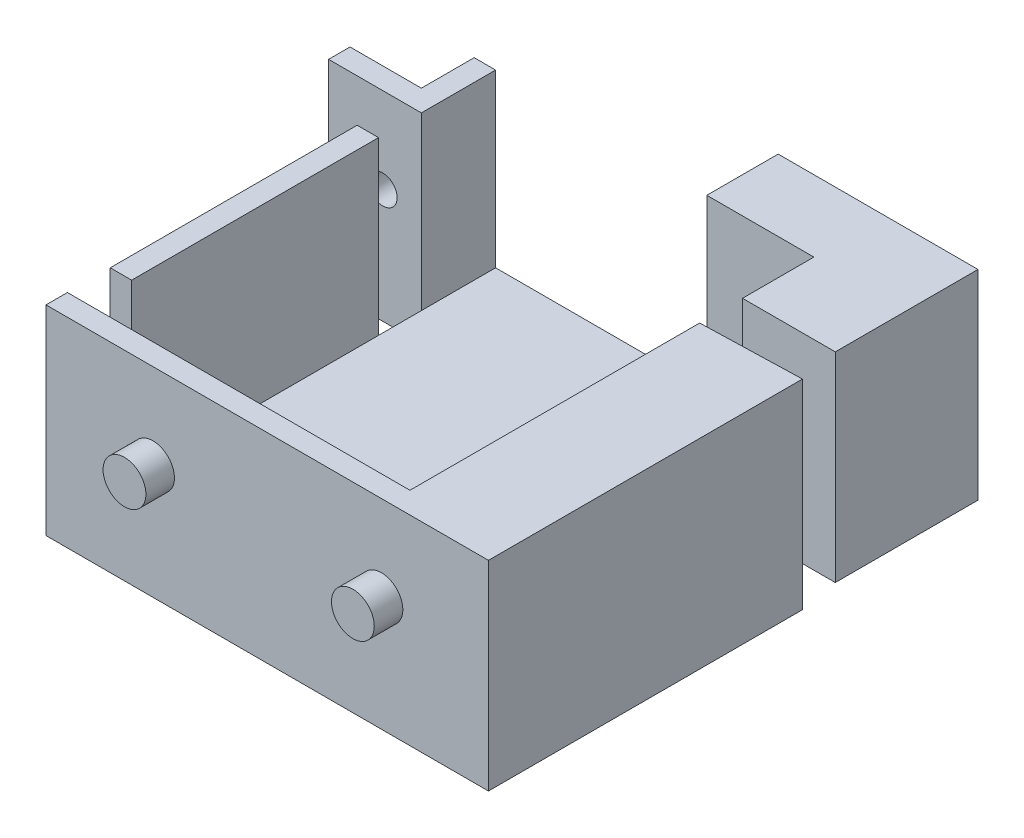
ISO-10303-21;
HEADER;
FILE_DESCRIPTION(('STEP AP214'),'2;1');
FILE_NAME('part.step','',(''),(''),'','','');
FILE_SCHEMA(('AUTOMOTIVE_DESIGN { 1 0 10303 214 1 1 1 1 }'));
ENDSEC;
DATA;
#1=APPLICATION_CONTEXT('core data for automotive mechanical design processes');
#2=APPLICATION_PROTOCOL_DEFINITION('international standard','automotive_design',2000,#1);
#3=PRODUCT_CONTEXT('',#1,'mechanical');
#4=PRODUCT('Part','Part','',(#3));
#5=PRODUCT_RELATED_PRODUCT_CATEGORY('part','',(#4));
#6=PRODUCT_DEFINITION_FORMATION('','',#4);
#7=PRODUCT_DEFINITION_CONTEXT('part definition',#1,'design');
#8=PRODUCT_DEFINITION('design','',#6,#7);
#9=PRODUCT_DEFINITION_SHAPE('','',#8);
#10=(LENGTH_UNIT() NAMED_UNIT(*) SI_UNIT(.MILLI.,.METRE.));
#11=(NAMED_UNIT(*) PLANE_ANGLE_UNIT() SI_UNIT($,.RADIAN.));
#12=(NAMED_UNIT(*) SI_UNIT($,.STERADIAN.) SOLID_ANGLE_UNIT());
#13=UNCERTAINTY_MEASURE_WITH_UNIT(LENGTH_MEASURE(1.E-05),#10,'distance_accuracy_value','');
#14=(GEOMETRIC_REPRESENTATION_CONTEXT(3) GLOBAL_UNCERTAINTY_ASSIGNED_CONTEXT((#13)) GLOBAL_UNIT_ASSIGNED_CONTEXT((#10,
#11,#12)) REPRESENTATION_CONTEXT('',''));
#15=CARTESIAN_POINT('',(0.,0.,0.));
#16=DIRECTION('',(0.,0.,1.));
#17=DIRECTION('',(1.,0.,0.));
#18=AXIS2_PLACEMENT_3D('',#15,#16,#17);
#19=CARTESIAN_POINT('',(-11.25,2.,15.));
#20=DIRECTION('',(1.,0.,0.));
#21=DIRECTION('',(0.,0.,-1.));
#22=AXIS2_PLACEMENT_3D('',#19,#20,#21);
#23=PLANE('',#22);
#24=DIRECTION('',(0.,0.,1.));
#25=VECTOR('',#24,1.);
#26=CARTESIAN_POINT('',(-11.25,0.,15.));
#27=LINE('',#26,#25);
#28=CARTESIAN_POINT('',(-11.25,0.,-9.8));
#29=VERTEX_POINT('',#28);
#30=CARTESIAN_POINT('',(-11.25,0.,-6.8));
#31=VERTEX_POINT('',#30);
#32=EDGE_CURVE('E223',#29,#31,#27,.T.);
#33=ORIENTED_EDGE('',*,*,#32,.T.);
#34=DIRECTION('',(0.,-1.,0.));
#35=VECTOR('',#34,1.);
#36=CARTESIAN_POINT('',(-11.25,37.0867927612304,-6.8));
#37=LINE('',#36,#35);
#38=CARTESIAN_POINT('',(-11.25,2.,-6.8));
#39=VERTEX_POINT('',#38);
#40=EDGE_CURVE('E57',#39,#31,#37,.T.);
#41=ORIENTED_EDGE('',*,*,#40,.F.);
#42=DIRECTION('',(0.,0.,1.));
#43=VECTOR('',#42,1.);
#44=CARTESIAN_POINT('',(-11.25,2.,15.));
#45=LINE('',#44,#43);
#46=CARTESIAN_POINT('',(-11.25,2.,-9.8));
#47=VERTEX_POINT('',#46);
#48=EDGE_CURVE('E401',#47,#39,#45,.T.);
#49=ORIENTED_EDGE('',*,*,#48,.F.);
#50=DIRECTION('',(0.,-1.,0.));
#51=VECTOR('',#50,1.);
#52=CARTESIAN_POINT('',(-11.25,37.0867927612304,-9.8));
#53=LINE('',#52,#51);
#54=EDGE_CURVE('E379',#47,#29,#53,.T.);
#55=ORIENTED_EDGE('',*,*,#54,.T.);
#56=EDGE_LOOP('',(#33,#41,#49,#55));
#57=FACE_BOUND('',#56,.T.);
#58=ADVANCED_FACE('F34',(#57),#23,.F.);
#59=CARTESIAN_POINT('',(0.,2.,0.));
#60=DIRECTION('',(0.,-1.,0.));
#61=DIRECTION('',(0.,0.,-1.));
#62=AXIS2_PLACEMENT_3D('',#59,#60,#61);
#63=PLANE('',#62);
#64=DIRECTION('',(-1.,0.,0.));
#65=VECTOR('',#64,1.);
#66=CARTESIAN_POINT('',(0.,2.,-14.8));
#67=LINE('',#66,#65);
#68=CARTESIAN_POINT('',(11.25,2.,-14.8));
#69=VERTEX_POINT('',#68);
#70=CARTESIAN_POINT('',(3.75,2.,-14.8));
#71=VERTEX_POINT('',#70);
#72=EDGE_CURVE('E322',#69,#71,#67,.T.);
#73=ORIENTED_EDGE('',*,*,#72,.T.);
#74=DIRECTION('',(0.,0.,-1.));
#75=VECTOR('',#74,1.);
#76=CARTESIAN_POINT('',(3.75,2.,0.));
#77=LINE('',#76,#75);
#78=CARTESIAN_POINT('',(3.75,2.,-15.));
#79=VERTEX_POINT('',#78);
#80=EDGE_CURVE('E326',#71,#79,#77,.T.);
#81=ORIENTED_EDGE('',*,*,#80,.T.);
#82=DIRECTION('',(-1.,0.,0.));
#83=VECTOR('',#82,1.);
#84=CARTESIAN_POINT('',(-11.25,2.,-15.));
#85=LINE('',#84,#83);
#86=CARTESIAN_POINT('',(-11.25,2.,-15.));
#87=VERTEX_POINT('',#86);
#88=EDGE_CURVE('E395',#79,#87,#85,.T.);
#89=ORIENTED_EDGE('',*,*,#88,.T.);
#90=EDGE_CURVE('E398',#87,#47,#45,.T.);
#91=ORIENTED_EDGE('',*,*,#90,.T.);
#92=ORIENTED_EDGE('',*,*,#48,.T.);
#93=DIRECTION('',(0.,0.,1.));
#94=VECTOR('',#93,1.);
#95=CARTESIAN_POINT('',(-11.25,2.,0.));
#96=LINE('',#95,#94);
#97=CARTESIAN_POINT('',(-11.25,2.,10.5));
#98=VERTEX_POINT('',#97);
#99=EDGE_CURVE('E256',#39,#98,#96,.T.);
#100=ORIENTED_EDGE('',*,*,#99,.T.);
#101=CARTESIAN_POINT('',(-11.25,2.,13.5));
#102=VERTEX_POINT('',#101);
#103=EDGE_CURVE('E49',#98,#102,#45,.T.);
#104=ORIENTED_EDGE('',*,*,#103,.T.);
#105=DIRECTION('',(-1.,0.,0.));
#106=VECTOR('',#105,1.);
#107=CARTESIAN_POINT('',(-11.25,2.,13.5));
#108=LINE('',#107,#106);
#109=CARTESIAN_POINT('',(11.25,2.,13.5));
#110=VERTEX_POINT('',#109);
#111=EDGE_CURVE('E381',#110,#102,#108,.T.);
#112=ORIENTED_EDGE('',*,*,#111,.F.);
#113=DIRECTION('',(0.,0.,-1.));
#114=VECTOR('',#113,1.);
#115=CARTESIAN_POINT('',(11.25,2.,15.));
#116=LINE('',#115,#114);
#117=CARTESIAN_POINT('',(11.25,2.,-6.79999999999999));
#118=VERTEX_POINT('',#117);
#119=EDGE_CURVE('E392',#110,#118,#116,.T.);
#120=ORIENTED_EDGE('',*,*,#119,.T.);
#121=CARTESIAN_POINT('',(11.25,2.,-9.8));
#122=VERTEX_POINT('',#121);
#123=EDGE_CURVE('E396',#118,#122,#116,.T.);
#124=ORIENTED_EDGE('',*,*,#123,.T.);
#125=DIRECTION('',(0.,0.,-1.));
#126=VECTOR('',#125,1.);
#127=CARTESIAN_POINT('',(11.25,2.,0.));
#128=LINE('',#127,#126);
#129=EDGE_CURVE('E320',#122,#69,#128,.T.);
#130=ORIENTED_EDGE('',*,*,#129,.T.);
#131=EDGE_LOOP('',(#73,#81,#89,#91,#92,#100,#104,#112,#120,#124,#130));
#132=FACE_BOUND('',#131,.T.);
#133=ADVANCED_FACE('F423',(#132),#63,.F.);
#134=CARTESIAN_POINT('',(11.25,2.,15.));
#135=DIRECTION('',(-1.,0.,0.));
#136=DIRECTION('',(0.,0.,1.));
#137=AXIS2_PLACEMENT_3D('',#134,#135,#136);
#138=PLANE('',#137);
#139=ORIENTED_EDGE('',*,*,#123,.F.);
#140=DIRECTION('',(0.,-1.,0.));
#141=VECTOR('',#140,1.);
#142=CARTESIAN_POINT('',(11.25,37.0867927612304,-6.79999999999999));
#143=LINE('',#142,#141);
#144=CARTESIAN_POINT('',(11.25,0.,-6.79999999999999));
#145=VERTEX_POINT('',#144);
#146=EDGE_CURVE('E278',#118,#145,#143,.T.);
#147=ORIENTED_EDGE('',*,*,#146,.T.);
#148=DIRECTION('',(0.,0.,-1.));
#149=VECTOR('',#148,1.);
#150=CARTESIAN_POINT('',(11.25,0.,15.));
#151=LINE('',#150,#149);
#152=CARTESIAN_POINT('',(11.25,0.,-9.8));
#153=VERTEX_POINT('',#152);
#154=EDGE_CURVE('E391',#145,#153,#151,.T.);
#155=ORIENTED_EDGE('',*,*,#154,.T.);
#156=DIRECTION('',(0.,-1.,0.));
#157=VECTOR('',#156,1.);
#158=CARTESIAN_POINT('',(11.25,37.0867927612304,-9.79999999999999));
#159=LINE('',#158,#157);
#160=EDGE_CURVE('E303',#122,#153,#159,.T.);
#161=ORIENTED_EDGE('',*,*,#160,.F.);
#162=EDGE_LOOP('',(#139,#147,#155,#161));
#163=FACE_BOUND('',#162,.T.);
#164=ADVANCED_FACE('F36',(#163),#138,.F.);
#165=CARTESIAN_POINT('',(-11.25,2.,-15.));
#166=DIRECTION('',(0.,0.,1.));
#167=DIRECTION('',(1.,0.,0.));
#168=AXIS2_PLACEMENT_3D('',#165,#166,#167);
#169=PLANE('',#168);
#170=ORIENTED_EDGE('',*,*,#88,.F.);
#171=DIRECTION('',(0.,-1.,0.));
#172=VECTOR('',#171,1.);
#173=CARTESIAN_POINT('',(3.75,2.,-15.));
#174=LINE('',#173,#172);
#175=CARTESIAN_POINT('',(3.75,0.,-15.));
#176=VERTEX_POINT('',#175);
#177=EDGE_CURVE('E324',#79,#176,#174,.T.);
#178=ORIENTED_EDGE('',*,*,#177,.T.);
#179=DIRECTION('',(-1.,0.,0.));
#180=VECTOR('',#179,1.);
#181=CARTESIAN_POINT('',(-11.25,0.,-15.));
#182=LINE('',#181,#180);
#183=CARTESIAN_POINT('',(-12.75,0.,-15.));
#184=VERTEX_POINT('',#183);
#185=EDGE_CURVE('E224',#176,#184,#182,.T.);
#186=ORIENTED_EDGE('',*,*,#185,.T.);
#187=DIRECTION('',(0.,-1.,0.));
#188=VECTOR('',#187,1.);
#189=CARTESIAN_POINT('',(-12.75,37.0867927612304,-15.));
#190=LINE('',#189,#188);
#191=CARTESIAN_POINT('',(-12.75,14.,-15.));
#192=VERTEX_POINT('',#191);
#193=EDGE_CURVE('E368',#192,#184,#190,.T.);
#194=ORIENTED_EDGE('',*,*,#193,.F.);
#195=DIRECTION('',(-1.,0.,0.));
#196=VECTOR('',#195,1.);
#197=CARTESIAN_POINT('',(-11.25,14.,-15.));
#198=LINE('',#197,#196);
#199=CARTESIAN_POINT('',(-11.25,14.,-15.));
#200=VERTEX_POINT('',#199);
#201=EDGE_CURVE('E349',#200,#192,#198,.T.);
#202=ORIENTED_EDGE('',*,*,#201,.F.);
#203=DIRECTION('',(0.,-1.,0.));
#204=VECTOR('',#203,1.);
#205=CARTESIAN_POINT('',(-11.25,37.0867927612304,-15.));
#206=LINE('',#205,#204);
#207=EDGE_CURVE('E345',#200,#87,#206,.T.);
#208=ORIENTED_EDGE('',*,*,#207,.T.);
#209=EDGE_LOOP('',(#170,#178,#186,#194,#202,#208));
#210=FACE_BOUND('',#209,.T.);
#211=ADVANCED_FACE('F433',(#210),#169,.F.);
#212=ORIENTED_EDGE('',*,*,#103,.F.);
#213=DIRECTION('',(0.,-1.,0.));
#214=VECTOR('',#213,1.);
#215=CARTESIAN_POINT('',(-11.25,37.0867927612304,10.5));
#216=LINE('',#215,#214);
#217=CARTESIAN_POINT('',(-11.25,0.,10.5));
#218=VERTEX_POINT('',#217);
#219=EDGE_CURVE('E227',#98,#218,#216,.T.);
#220=ORIENTED_EDGE('',*,*,#219,.T.);
#221=CARTESIAN_POINT('',(-11.25,0.,13.5));
#222=VERTEX_POINT('',#221);
#223=EDGE_CURVE('E212',#218,#222,#27,.T.);
#224=ORIENTED_EDGE('',*,*,#223,.T.);
#225=DIRECTION('',(0.,-1.,0.));
#226=VECTOR('',#225,1.);
#227=CARTESIAN_POINT('',(-11.25,37.0867927612304,13.5));
#228=LINE('',#227,#226);
#229=EDGE_CURVE('E339',#102,#222,#228,.T.);
#230=ORIENTED_EDGE('',*,*,#229,.F.);
#231=EDGE_LOOP('',(#212,#220,#224,#230));
#232=FACE_BOUND('',#231,.T.);
#233=ADVANCED_FACE('F228',(#232),#23,.F.);
#234=CARTESIAN_POINT('',(-11.25,2.,15.));
#235=DIRECTION('',(0.,0.,-1.));
#236=DIRECTION('',(-1.,0.,0.));
#237=AXIS2_PLACEMENT_3D('',#234,#235,#236);
#238=PLANE('',#237);
#239=CARTESIAN_POINT('',(-5.24999999999996,8.,15.));
#240=DIRECTION('',(0.,0.,-1.));
#241=DIRECTION('',(-1.,0.,0.));
#242=AXIS2_PLACEMENT_3D('',#239,#240,#241);
#243=CIRCLE('',#242,1.5);
#244=CARTESIAN_POINT('',(-6.74999999999996,8.,15.));
#245=VERTEX_POINT('',#244);
#246=EDGE_CURVE('E11',#245,#245,#243,.F.);
#247=ORIENTED_EDGE('',*,*,#246,.F.);
#248=EDGE_LOOP('',(#247));
#249=FACE_BOUND('',#248,.T.);
#250=CARTESIAN_POINT('',(10.75,8.,15.));
#251=DIRECTION('',(0.,0.,-1.));
#252=DIRECTION('',(-1.,0.,0.));
#253=AXIS2_PLACEMENT_3D('',#250,#251,#252);
#254=CIRCLE('',#253,1.5);
#255=CARTESIAN_POINT('',(9.25,8.,15.));
#256=VERTEX_POINT('',#255);
#257=EDGE_CURVE('E42',#256,#256,#254,.F.);
#258=ORIENTED_EDGE('',*,*,#257,.F.);
#259=EDGE_LOOP('',(#258));
#260=FACE_BOUND('',#259,.T.);
#261=DIRECTION('',(1.,0.,0.));
#262=VECTOR('',#261,1.);
#263=CARTESIAN_POINT('',(-11.25,0.,15.));
#264=LINE('',#263,#262);
#265=CARTESIAN_POINT('',(-12.75,0.,15.));
#266=VERTEX_POINT('',#265);
#267=CARTESIAN_POINT('',(18.25,0.,15.));
#268=VERTEX_POINT('',#267);
#269=EDGE_CURVE('E404',#266,#268,#264,.T.);
#270=ORIENTED_EDGE('',*,*,#269,.T.);
#271=DIRECTION('',(0.,-1.,0.));
#272=VECTOR('',#271,1.);
#273=CARTESIAN_POINT('',(18.25,37.0867927612304,15.));
#274=LINE('',#273,#272);
#275=CARTESIAN_POINT('',(18.25,14.,15.));
#276=VERTEX_POINT('',#275);
#277=EDGE_CURVE('E273',#276,#268,#274,.T.);
#278=ORIENTED_EDGE('',*,*,#277,.F.);
#279=DIRECTION('',(1.,0.,0.));
#280=VECTOR('',#279,1.);
#281=CARTESIAN_POINT('',(-11.25,14.,15.));
#282=LINE('',#281,#280);
#283=CARTESIAN_POINT('',(-12.75,14.,15.));
#284=VERTEX_POINT('',#283);
#285=EDGE_CURVE('E382',#284,#276,#282,.T.);
#286=ORIENTED_EDGE('',*,*,#285,.F.);
#287=DIRECTION('',(0.,-1.,0.));
#288=VECTOR('',#287,1.);
#289=CARTESIAN_POINT('',(-12.75,37.0867927612304,15.));
#290=LINE('',#289,#288);
#291=EDGE_CURVE('E333',#284,#266,#290,.T.);
#292=ORIENTED_EDGE('',*,*,#291,.T.);
#293=EDGE_LOOP('',(#270,#278,#286,#292));
#294=FACE_BOUND('',#293,.T.);
#295=ADVANCED_FACE('F475',(#249,#260,#294),#238,.F.);
#296=CARTESIAN_POINT('',(0.,0.,0.));
#297=DIRECTION('',(0.,-1.,0.));
#298=DIRECTION('',(0.,0.,-1.));
#299=AXIS2_PLACEMENT_3D('',#296,#297,#298);
#300=PLANE('',#299);
#301=ORIENTED_EDGE('',*,*,#185,.F.);
#302=DIRECTION('',(0.,0.,-1.));
#303=VECTOR('',#302,1.);
#304=CARTESIAN_POINT('',(3.75,0.,-14.8));
#305=LINE('',#304,#303);
#306=CARTESIAN_POINT('',(3.75,0.,-19.8));
#307=VERTEX_POINT('',#306);
#308=EDGE_CURVE('E267',#176,#307,#305,.T.);
#309=ORIENTED_EDGE('',*,*,#308,.T.);
#310=DIRECTION('',(1.,0.,0.));
#311=VECTOR('',#310,1.);
#312=CARTESIAN_POINT('',(3.75,0.,-19.8));
#313=LINE('',#312,#311);
#314=CARTESIAN_POINT('',(17.75,0.,-19.8));
#315=VERTEX_POINT('',#314);
#316=EDGE_CURVE('E294',#307,#315,#313,.T.);
#317=ORIENTED_EDGE('',*,*,#316,.T.);
#318=DIRECTION('',(0.,0.,1.));
#319=VECTOR('',#318,1.);
#320=CARTESIAN_POINT('',(17.75,0.,-11.3));
#321=LINE('',#320,#319);
#322=CARTESIAN_POINT('',(17.75,0.,-9.79999999999999));
#323=VERTEX_POINT('',#322);
#324=EDGE_CURVE('E297',#315,#323,#321,.T.);
#325=ORIENTED_EDGE('',*,*,#324,.T.);
#326=DIRECTION('',(-1.,0.,0.));
#327=VECTOR('',#326,1.);
#328=CARTESIAN_POINT('',(17.75,0.,-9.79999999999999));
#329=LINE('',#328,#327);
#330=EDGE_CURVE('E300',#323,#153,#329,.T.);
#331=ORIENTED_EDGE('',*,*,#330,.T.);
#332=ORIENTED_EDGE('',*,*,#154,.F.);
#333=DIRECTION('',(0.999592086460695,0.,-0.0285597738988772));
#334=VECTOR('',#333,1.);
#335=CARTESIAN_POINT('',(18.25,0.,-7.));
#336=LINE('',#335,#334);
#337=CARTESIAN_POINT('',(18.25,0.,-7.));
#338=VERTEX_POINT('',#337);
#339=EDGE_CURVE('E270',#145,#338,#336,.T.);
#340=ORIENTED_EDGE('',*,*,#339,.T.);
#341=DIRECTION('',(0.,0.,1.));
#342=VECTOR('',#341,1.);
#343=CARTESIAN_POINT('',(18.25,0.,-7.));
#344=LINE('',#343,#342);
#345=EDGE_CURVE('E259',#338,#268,#344,.T.);
#346=ORIENTED_EDGE('',*,*,#345,.T.);
#347=ORIENTED_EDGE('',*,*,#269,.F.);
#348=DIRECTION('',(0.,0.,-1.));
#349=VECTOR('',#348,1.);
#350=CARTESIAN_POINT('',(-12.75,0.,13.5));
#351=LINE('',#350,#349);
#352=CARTESIAN_POINT('',(-12.75,0.,13.5));
#353=VERTEX_POINT('',#352);
#354=EDGE_CURVE('E328',#266,#353,#351,.T.);
#355=ORIENTED_EDGE('',*,*,#354,.T.);
#356=DIRECTION('',(1.,0.,0.));
#357=VECTOR('',#356,1.);
#358=CARTESIAN_POINT('',(-11.25,0.,13.5));
#359=LINE('',#358,#357);
#360=EDGE_CURVE('E221',#353,#222,#359,.T.);
#361=ORIENTED_EDGE('',*,*,#360,.T.);
#362=ORIENTED_EDGE('',*,*,#223,.F.);
#363=DIRECTION('',(-1.,0.,0.));
#364=VECTOR('',#363,1.);
#365=CARTESIAN_POINT('',(-11.25,0.,10.5));
#366=LINE('',#365,#364);
#367=CARTESIAN_POINT('',(-12.75,0.,10.5));
#368=VERTEX_POINT('',#367);
#369=EDGE_CURVE('E217',#218,#368,#366,.T.);
#370=ORIENTED_EDGE('',*,*,#369,.T.);
#371=DIRECTION('',(0.,0.,-1.));
#372=VECTOR('',#371,1.);
#373=CARTESIAN_POINT('',(-12.75,0.,-6.8));
#374=LINE('',#373,#372);
#375=CARTESIAN_POINT('',(-12.75,0.,-6.8));
#376=VERTEX_POINT('',#375);
#377=EDGE_CURVE('E239',#368,#376,#374,.T.);
#378=ORIENTED_EDGE('',*,*,#377,.T.);
#379=DIRECTION('',(1.,0.,0.));
#380=VECTOR('',#379,1.);
#381=CARTESIAN_POINT('',(-12.75,0.,-6.8));
#382=LINE('',#381,#380);
#383=EDGE_CURVE('E240',#376,#31,#382,.T.);
#384=ORIENTED_EDGE('',*,*,#383,.T.);
#385=ORIENTED_EDGE('',*,*,#32,.F.);
#386=DIRECTION('',(-1.,0.,0.));
#387=VECTOR('',#386,1.);
#388=CARTESIAN_POINT('',(-17.75,0.,-9.8));
#389=LINE('',#388,#387);
#390=CARTESIAN_POINT('',(-17.75,0.,-9.8));
#391=VERTEX_POINT('',#390);
#392=EDGE_CURVE('E332',#29,#391,#389,.T.);
#393=ORIENTED_EDGE('',*,*,#392,.T.);
#394=DIRECTION('',(0.,0.,-1.));
#395=VECTOR('',#394,1.);
#396=CARTESIAN_POINT('',(-17.75,0.,-11.3));
#397=LINE('',#396,#395);
#398=CARTESIAN_POINT('',(-17.75,0.,-11.3));
#399=VERTEX_POINT('',#398);
#400=EDGE_CURVE('E356',#391,#399,#397,.T.);
#401=ORIENTED_EDGE('',*,*,#400,.T.);
#402=DIRECTION('',(1.,0.,0.));
#403=VECTOR('',#402,1.);
#404=CARTESIAN_POINT('',(-12.75,0.,-11.3));
#405=LINE('',#404,#403);
#406=CARTESIAN_POINT('',(-12.75,0.,-11.3));
#407=VERTEX_POINT('',#406);
#408=EDGE_CURVE('E359',#399,#407,#405,.T.);
#409=ORIENTED_EDGE('',*,*,#408,.T.);
#410=DIRECTION('',(0.,0.,-1.));
#411=VECTOR('',#410,1.);
#412=CARTESIAN_POINT('',(-12.75,0.,-15.));
#413=LINE('',#412,#411);
#414=EDGE_CURVE('E362',#407,#184,#413,.T.);
#415=ORIENTED_EDGE('',*,*,#414,.T.);
#416=EDGE_LOOP('',(#301,#309,#317,#325,#331,#332,#340,#346,#347,#355,#361,#362,#370,#378,#384,
#385,#393,#401,#409,#415));
#417=FACE_BOUND('',#416,.T.);
#418=ADVANCED_FACE('F214',(#417),#300,.T.);
#419=CARTESIAN_POINT('',(-11.25,14.,13.5));
#420=DIRECTION('',(0.,0.,1.));
#421=DIRECTION('',(1.,0.,0.));
#422=AXIS2_PLACEMENT_3D('',#419,#420,#421);
#423=PLANE('',#422);
#424=ORIENTED_EDGE('',*,*,#111,.T.);
#425=ORIENTED_EDGE('',*,*,#229,.T.);
#426=ORIENTED_EDGE('',*,*,#360,.F.);
#427=DIRECTION('',(0.,-1.,0.));
#428=VECTOR('',#427,1.);
#429=CARTESIAN_POINT('',(-12.75,37.0867927612304,13.5));
#430=LINE('',#429,#428);
#431=CARTESIAN_POINT('',(-12.75,14.,13.5));
#432=VERTEX_POINT('',#431);
#433=EDGE_CURVE('E336',#432,#353,#430,.T.);
#434=ORIENTED_EDGE('',*,*,#433,.F.);
#435=DIRECTION('',(-1.,0.,0.));
#436=VECTOR('',#435,1.);
#437=CARTESIAN_POINT('',(-11.25,14.,13.5));
#438=LINE('',#437,#436);
#439=CARTESIAN_POINT('',(11.25,14.,13.5));
#440=VERTEX_POINT('',#439);
#441=EDGE_CURVE('E384',#440,#432,#438,.T.);
#442=ORIENTED_EDGE('',*,*,#441,.F.);
#443=DIRECTION('',(0.,-1.,0.));
#444=VECTOR('',#443,1.);
#445=CARTESIAN_POINT('',(11.25,14.,13.5));
#446=LINE('',#445,#444);
#447=EDGE_CURVE('E386',#440,#110,#446,.T.);
#448=ORIENTED_EDGE('',*,*,#447,.T.);
#449=EDGE_LOOP('',(#424,#425,#426,#434,#442,#448));
#450=FACE_BOUND('',#449,.T.);
#451=ADVANCED_FACE('F626',(#450),#423,.F.);
#452=CARTESIAN_POINT('',(0.,14.,0.));
#453=DIRECTION('',(0.,-1.,0.));
#454=DIRECTION('',(0.,0.,-1.));
#455=AXIS2_PLACEMENT_3D('',#452,#453,#454);
#456=PLANE('',#455);
#457=ORIENTED_EDGE('',*,*,#441,.T.);
#458=DIRECTION('',(0.,0.,1.));
#459=VECTOR('',#458,1.);
#460=CARTESIAN_POINT('',(-12.75,14.,13.5));
#461=LINE('',#460,#459);
#462=EDGE_CURVE('E329',#432,#284,#461,.T.);
#463=ORIENTED_EDGE('',*,*,#462,.T.);
#464=ORIENTED_EDGE('',*,*,#285,.T.);
#465=DIRECTION('',(0.,0.,-1.));
#466=VECTOR('',#465,1.);
#467=CARTESIAN_POINT('',(18.25,14.,-7.));
#468=LINE('',#467,#466);
#469=CARTESIAN_POINT('',(18.25,14.,-7.));
#470=VERTEX_POINT('',#469);
#471=EDGE_CURVE('E265',#276,#470,#468,.T.);
#472=ORIENTED_EDGE('',*,*,#471,.T.);
#473=DIRECTION('',(-0.999592086460695,0.,0.0285597738988772));
#474=VECTOR('',#473,1.);
#475=CARTESIAN_POINT('',(18.25,14.,-7.));
#476=LINE('',#475,#474);
#477=CARTESIAN_POINT('',(11.25,14.,-6.79999999999999));
#478=VERTEX_POINT('',#477);
#479=EDGE_CURVE('E262',#470,#478,#476,.T.);
#480=ORIENTED_EDGE('',*,*,#479,.T.);
#481=DIRECTION('',(0.,0.,1.));
#482=VECTOR('',#481,1.);
#483=CARTESIAN_POINT('',(11.25,14.,15.));
#484=LINE('',#483,#482);
#485=EDGE_CURVE('E260',#478,#440,#484,.T.);
#486=ORIENTED_EDGE('',*,*,#485,.T.);
#487=EDGE_LOOP('',(#457,#463,#464,#472,#480,#486));
#488=FACE_BOUND('',#487,.T.);
#489=ADVANCED_FACE('F627',(#488),#456,.F.);
#490=CARTESIAN_POINT('',(-11.25,37.0867927612304,-9.8));
#491=DIRECTION('',(1.,0.,0.));
#492=DIRECTION('',(0.,0.,-1.));
#493=AXIS2_PLACEMENT_3D('',#490,#491,#492);
#494=PLANE('',#493);
#495=ORIENTED_EDGE('',*,*,#90,.F.);
#496=ORIENTED_EDGE('',*,*,#207,.F.);
#497=DIRECTION('',(0.,0.,-1.));
#498=VECTOR('',#497,1.);
#499=CARTESIAN_POINT('',(-11.25,14.,-9.8));
#500=LINE('',#499,#498);
#501=CARTESIAN_POINT('',(-11.25,14.,-9.8));
#502=VERTEX_POINT('',#501);
#503=EDGE_CURVE('E351',#502,#200,#500,.T.);
#504=ORIENTED_EDGE('',*,*,#503,.F.);
#505=EDGE_CURVE('E365',#502,#47,#53,.T.);
#506=ORIENTED_EDGE('',*,*,#505,.T.);
#507=EDGE_LOOP('',(#495,#496,#504,#506));
#508=FACE_BOUND('',#507,.T.);
#509=ADVANCED_FACE('F429',(#508),#494,.T.);
#510=CARTESIAN_POINT('',(-12.75,37.0867927612304,-15.));
#511=DIRECTION('',(-1.,0.,0.));
#512=DIRECTION('',(0.,0.,1.));
#513=AXIS2_PLACEMENT_3D('',#510,#511,#512);
#514=PLANE('',#513);
#515=DIRECTION('',(0.,0.,1.));
#516=VECTOR('',#515,1.);
#517=CARTESIAN_POINT('',(-12.75,14.,-15.));
#518=LINE('',#517,#516);
#519=CARTESIAN_POINT('',(-12.75,14.,-11.3));
#520=VERTEX_POINT('',#519);
#521=EDGE_CURVE('E347',#192,#520,#518,.T.);
#522=ORIENTED_EDGE('',*,*,#521,.F.);
#523=ORIENTED_EDGE('',*,*,#193,.T.);
#524=ORIENTED_EDGE('',*,*,#414,.F.);
#525=DIRECTION('',(0.,-1.,0.));
#526=VECTOR('',#525,1.);
#527=CARTESIAN_POINT('',(-12.75,37.0867927612304,-11.3));
#528=LINE('',#527,#526);
#529=EDGE_CURVE('E371',#520,#407,#528,.T.);
#530=ORIENTED_EDGE('',*,*,#529,.F.);
#531=EDGE_LOOP('',(#522,#523,#524,#530));
#532=FACE_BOUND('',#531,.T.);
#533=ADVANCED_FACE('F442',(#532),#514,.T.);
#534=CARTESIAN_POINT('',(-12.75,37.0867927612304,-11.3));
#535=DIRECTION('',(0.,0.,-1.));
#536=DIRECTION('',(-1.,0.,0.));
#537=AXIS2_PLACEMENT_3D('',#534,#535,#536);
#538=PLANE('',#537);
#539=CARTESIAN_POINT('',(-13.95,8.,-11.3));
#540=DIRECTION('',(0.,0.,-1.));
#541=DIRECTION('',(-1.,0.,0.));
#542=AXIS2_PLACEMENT_3D('',#539,#540,#541);
#543=CIRCLE('',#542,1.);
#544=CARTESIAN_POINT('',(-14.95,8.,-11.3));
#545=VERTEX_POINT('',#544);
#546=EDGE_CURVE('E570',#545,#545,#543,.T.);
#547=ORIENTED_EDGE('',*,*,#546,.F.);
#548=EDGE_LOOP('',(#547));
#549=FACE_BOUND('',#548,.T.);
#550=DIRECTION('',(-1.,0.,0.));
#551=VECTOR('',#550,1.);
#552=CARTESIAN_POINT('',(-12.75,14.,-11.3));
#553=LINE('',#552,#551);
#554=CARTESIAN_POINT('',(-17.75,14.,-11.3));
#555=VERTEX_POINT('',#554);
#556=EDGE_CURVE('E344',#520,#555,#553,.T.);
#557=ORIENTED_EDGE('',*,*,#556,.F.);
#558=ORIENTED_EDGE('',*,*,#529,.T.);
#559=ORIENTED_EDGE('',*,*,#408,.F.);
#560=DIRECTION('',(0.,-1.,0.));
#561=VECTOR('',#560,1.);
#562=CARTESIAN_POINT('',(-17.75,37.0867927612304,-11.3));
#563=LINE('',#562,#561);
#564=EDGE_CURVE('E373',#555,#399,#563,.T.);
#565=ORIENTED_EDGE('',*,*,#564,.F.);
#566=EDGE_LOOP('',(#557,#558,#559,#565));
#567=FACE_BOUND('',#566,.T.);
#568=ADVANCED_FACE('F446',(#549,#567),#538,.T.);
#569=CARTESIAN_POINT('',(-17.75,37.0867927612304,-11.3));
#570=DIRECTION('',(-1.,0.,0.));
#571=DIRECTION('',(0.,0.,1.));
#572=AXIS2_PLACEMENT_3D('',#569,#570,#571);
#573=PLANE('',#572);
#574=DIRECTION('',(0.,0.,1.));
#575=VECTOR('',#574,1.);
#576=CARTESIAN_POINT('',(-17.75,14.,-11.3));
#577=LINE('',#576,#575);
#578=CARTESIAN_POINT('',(-17.75,14.,-9.8));
#579=VERTEX_POINT('',#578);
#580=EDGE_CURVE('E342',#555,#579,#577,.T.);
#581=ORIENTED_EDGE('',*,*,#580,.F.);
#582=ORIENTED_EDGE('',*,*,#564,.T.);
#583=ORIENTED_EDGE('',*,*,#400,.F.);
#584=DIRECTION('',(0.,-1.,0.));
#585=VECTOR('',#584,1.);
#586=CARTESIAN_POINT('',(-17.75,37.0867927612304,-9.8));
#587=LINE('',#586,#585);
#588=EDGE_CURVE('E375',#579,#391,#587,.T.);
#589=ORIENTED_EDGE('',*,*,#588,.F.);
#590=EDGE_LOOP('',(#581,#582,#583,#589));
#591=FACE_BOUND('',#590,.T.);
#592=ADVANCED_FACE('F451',(#591),#573,.T.);
#593=CARTESIAN_POINT('',(-17.75,37.0867927612304,-9.8));
#594=DIRECTION('',(0.,0.,1.));
#595=DIRECTION('',(1.,0.,0.));
#596=AXIS2_PLACEMENT_3D('',#593,#594,#595);
#597=PLANE('',#596);
#598=CARTESIAN_POINT('',(-13.95,8.,-9.8));
#599=DIRECTION('',(0.,0.,1.));
#600=DIRECTION('',(1.,0.,0.));
#601=AXIS2_PLACEMENT_3D('',#598,#599,#600);
#602=CIRCLE('',#601,1.);
#603=CARTESIAN_POINT('',(-12.95,8.,-9.8));
#604=VERTEX_POINT('',#603);
#605=EDGE_CURVE('E573',#604,#604,#602,.F.);
#606=ORIENTED_EDGE('',*,*,#605,.T.);
#607=EDGE_LOOP('',(#606));
#608=FACE_BOUND('',#607,.T.);
#609=DIRECTION('',(1.,0.,0.));
#610=VECTOR('',#609,1.);
#611=CARTESIAN_POINT('',(-17.75,14.,-9.8));
#612=LINE('',#611,#610);
#613=EDGE_CURVE('E353',#579,#502,#612,.T.);
#614=ORIENTED_EDGE('',*,*,#613,.F.);
#615=ORIENTED_EDGE('',*,*,#588,.T.);
#616=ORIENTED_EDGE('',*,*,#392,.F.);
#617=ORIENTED_EDGE('',*,*,#54,.F.);
#618=ORIENTED_EDGE('',*,*,#505,.F.);
#619=EDGE_LOOP('',(#614,#615,#616,#617,#618));
#620=FACE_BOUND('',#619,.T.);
#621=ADVANCED_FACE('F454',(#608,#620),#597,.T.);
#622=CARTESIAN_POINT('',(0.,14.,0.));
#623=DIRECTION('',(0.,-1.,0.));
#624=DIRECTION('',(0.,0.,-1.));
#625=AXIS2_PLACEMENT_3D('',#622,#623,#624);
#626=PLANE('',#625);
#627=ORIENTED_EDGE('',*,*,#503,.T.);
#628=ORIENTED_EDGE('',*,*,#201,.T.);
#629=ORIENTED_EDGE('',*,*,#521,.T.);
#630=ORIENTED_EDGE('',*,*,#556,.T.);
#631=ORIENTED_EDGE('',*,*,#580,.T.);
#632=ORIENTED_EDGE('',*,*,#613,.T.);
#633=EDGE_LOOP('',(#627,#628,#629,#630,#631,#632));
#634=FACE_BOUND('',#633,.T.);
#635=ADVANCED_FACE('F438',(#634),#626,.F.);
#636=CARTESIAN_POINT('',(-12.75,37.0867927612304,13.5));
#637=DIRECTION('',(-1.,0.,0.));
#638=DIRECTION('',(0.,0.,1.));
#639=AXIS2_PLACEMENT_3D('',#636,#637,#638);
#640=PLANE('',#639);
#641=ORIENTED_EDGE('',*,*,#462,.F.);
#642=ORIENTED_EDGE('',*,*,#433,.T.);
#643=ORIENTED_EDGE('',*,*,#354,.F.);
#644=ORIENTED_EDGE('',*,*,#291,.F.);
#645=EDGE_LOOP('',(#641,#642,#643,#644));
#646=FACE_BOUND('',#645,.T.);
#647=ADVANCED_FACE('F462',(#646),#640,.T.);
#648=CARTESIAN_POINT('',(3.75,37.0867927612304,-14.8));
#649=DIRECTION('',(-1.,0.,0.));
#650=DIRECTION('',(0.,0.,1.));
#651=AXIS2_PLACEMENT_3D('',#648,#649,#650);
#652=PLANE('',#651);
#653=ORIENTED_EDGE('',*,*,#80,.F.);
#654=DIRECTION('',(0.,-1.,0.));
#655=VECTOR('',#654,1.);
#656=CARTESIAN_POINT('',(3.75,37.0867927612304,-14.8));
#657=LINE('',#656,#655);
#658=CARTESIAN_POINT('',(3.75,14.,-14.8));
#659=VERTEX_POINT('',#658);
#660=EDGE_CURVE('E310',#659,#71,#657,.T.);
#661=ORIENTED_EDGE('',*,*,#660,.F.);
#662=DIRECTION('',(0.,0.,1.));
#663=VECTOR('',#662,1.);
#664=CARTESIAN_POINT('',(3.75,14.,-14.8));
#665=LINE('',#664,#663);
#666=CARTESIAN_POINT('',(3.75,14.,-19.8));
#667=VERTEX_POINT('',#666);
#668=EDGE_CURVE('E283',#667,#659,#665,.T.);
#669=ORIENTED_EDGE('',*,*,#668,.F.);
#670=DIRECTION('',(0.,-1.,0.));
#671=VECTOR('',#670,1.);
#672=CARTESIAN_POINT('',(3.75,37.0867927612304,-19.8));
#673=LINE('',#672,#671);
#674=EDGE_CURVE('E307',#667,#307,#673,.T.);
#675=ORIENTED_EDGE('',*,*,#674,.T.);
#676=ORIENTED_EDGE('',*,*,#308,.F.);
#677=ORIENTED_EDGE('',*,*,#177,.F.);
#678=EDGE_LOOP('',(#653,#661,#669,#675,#676,#677));
#679=FACE_BOUND('',#678,.T.);
#680=ADVANCED_FACE('F522',(#679),#652,.T.);
#681=CARTESIAN_POINT('',(11.25,37.0867927612304,-14.8));
#682=DIRECTION('',(0.,0.,1.));
#683=DIRECTION('',(1.,0.,0.));
#684=AXIS2_PLACEMENT_3D('',#681,#682,#683);
#685=PLANE('',#684);
#686=ORIENTED_EDGE('',*,*,#72,.F.);
#687=DIRECTION('',(0.,-1.,0.));
#688=VECTOR('',#687,1.);
#689=CARTESIAN_POINT('',(11.25,37.0867927612304,-14.8));
#690=LINE('',#689,#688);
#691=CARTESIAN_POINT('',(11.25,14.,-14.8));
#692=VERTEX_POINT('',#691);
#693=EDGE_CURVE('E313',#692,#69,#690,.T.);
#694=ORIENTED_EDGE('',*,*,#693,.F.);
#695=DIRECTION('',(1.,0.,0.));
#696=VECTOR('',#695,1.);
#697=CARTESIAN_POINT('',(11.25,14.,-14.8));
#698=LINE('',#697,#696);
#699=EDGE_CURVE('E281',#659,#692,#698,.T.);
#700=ORIENTED_EDGE('',*,*,#699,.F.);
#701=ORIENTED_EDGE('',*,*,#660,.T.);
#702=EDGE_LOOP('',(#686,#694,#700,#701));
#703=FACE_BOUND('',#702,.T.);
#704=ADVANCED_FACE('F517',(#703),#685,.T.);
#705=CARTESIAN_POINT('',(11.25,37.0867927612304,-9.79999999999999));
#706=DIRECTION('',(-1.,0.,0.));
#707=DIRECTION('',(0.,0.,1.));
#708=AXIS2_PLACEMENT_3D('',#705,#706,#707);
#709=PLANE('',#708);
#710=ORIENTED_EDGE('',*,*,#129,.F.);
#711=CARTESIAN_POINT('',(11.25,14.,-9.79999999999999));
#712=VERTEX_POINT('',#711);
#713=EDGE_CURVE('E316',#712,#122,#159,.T.);
#714=ORIENTED_EDGE('',*,*,#713,.F.);
#715=DIRECTION('',(0.,0.,1.));
#716=VECTOR('',#715,1.);
#717=CARTESIAN_POINT('',(11.25,14.,-9.79999999999999));
#718=LINE('',#717,#716);
#719=EDGE_CURVE('E292',#692,#712,#718,.T.);
#720=ORIENTED_EDGE('',*,*,#719,.F.);
#721=ORIENTED_EDGE('',*,*,#693,.T.);
#722=EDGE_LOOP('',(#710,#714,#720,#721));
#723=FACE_BOUND('',#722,.T.);
#724=ADVANCED_FACE('F512',(#723),#709,.T.);
#725=CARTESIAN_POINT('',(17.75,37.0867927612304,-9.79999999999999));
#726=DIRECTION('',(0.,0.,1.));
#727=DIRECTION('',(1.,0.,0.));
#728=AXIS2_PLACEMENT_3D('',#725,#726,#727);
#729=PLANE('',#728);
#730=CARTESIAN_POINT('',(13.95,8.,-9.8));
#731=DIRECTION('',(0.,0.,1.));
#732=DIRECTION('',(1.,0.,0.));
#733=AXIS2_PLACEMENT_3D('',#730,#731,#732);
#734=CIRCLE('',#733,0.999999999999999);
#735=CARTESIAN_POINT('',(14.95,8.,-9.8));
#736=VERTEX_POINT('',#735);
#737=EDGE_CURVE('E877',#736,#736,#734,.F.);
#738=ORIENTED_EDGE('',*,*,#737,.T.);
#739=EDGE_LOOP('',(#738));
#740=FACE_BOUND('',#739,.T.);
#741=DIRECTION('',(1.,0.,0.));
#742=VECTOR('',#741,1.);
#743=CARTESIAN_POINT('',(17.75,14.,-9.79999999999999));
#744=LINE('',#743,#742);
#745=CARTESIAN_POINT('',(17.75,14.,-9.79999999999999));
#746=VERTEX_POINT('',#745);
#747=EDGE_CURVE('E290',#712,#746,#744,.T.);
#748=ORIENTED_EDGE('',*,*,#747,.F.);
#749=ORIENTED_EDGE('',*,*,#713,.T.);
#750=ORIENTED_EDGE('',*,*,#160,.T.);
#751=ORIENTED_EDGE('',*,*,#330,.F.);
#752=DIRECTION('',(0.,-1.,0.));
#753=VECTOR('',#752,1.);
#754=CARTESIAN_POINT('',(17.75,37.0867927612304,-9.79999999999999));
#755=LINE('',#754,#753);
#756=EDGE_CURVE('E284',#746,#323,#755,.T.);
#757=ORIENTED_EDGE('',*,*,#756,.F.);
#758=EDGE_LOOP('',(#748,#749,#750,#751,#757));
#759=FACE_BOUND('',#758,.T.);
#760=ADVANCED_FACE('F507',(#740,#759),#729,.T.);
#761=CARTESIAN_POINT('',(17.75,37.0867927612304,-11.3));
#762=DIRECTION('',(1.,0.,0.));
#763=DIRECTION('',(0.,0.,-1.));
#764=AXIS2_PLACEMENT_3D('',#761,#762,#763);
#765=PLANE('',#764);
#766=DIRECTION('',(0.,0.,-1.));
#767=VECTOR('',#766,1.);
#768=CARTESIAN_POINT('',(17.75,14.,-11.3));
#769=LINE('',#768,#767);
#770=CARTESIAN_POINT('',(17.75,14.,-19.8));
#771=VERTEX_POINT('',#770);
#772=EDGE_CURVE('E288',#746,#771,#769,.T.);
#773=ORIENTED_EDGE('',*,*,#772,.F.);
#774=ORIENTED_EDGE('',*,*,#756,.T.);
#775=ORIENTED_EDGE('',*,*,#324,.F.);
#776=DIRECTION('',(0.,-1.,0.));
#777=VECTOR('',#776,1.);
#778=CARTESIAN_POINT('',(17.75,37.0867927612304,-19.8));
#779=LINE('',#778,#777);
#780=EDGE_CURVE('E305',#771,#315,#779,.T.);
#781=ORIENTED_EDGE('',*,*,#780,.F.);
#782=EDGE_LOOP('',(#773,#774,#775,#781));
#783=FACE_BOUND('',#782,.T.);
#784=ADVANCED_FACE('F533',(#783),#765,.T.);
#785=CARTESIAN_POINT('',(3.75,37.0867927612304,-19.8));
#786=DIRECTION('',(0.,0.,-1.));
#787=DIRECTION('',(-1.,0.,0.));
#788=AXIS2_PLACEMENT_3D('',#785,#786,#787);
#789=PLANE('',#788);
#790=CARTESIAN_POINT('',(10.75,8.,-19.8));
#791=DIRECTION('',(0.,0.,-1.));
#792=DIRECTION('',(-1.,0.,0.));
#793=AXIS2_PLACEMENT_3D('',#790,#791,#792);
#794=CIRCLE('',#793,1.5);
#795=CARTESIAN_POINT('',(9.25000000000001,8.,-19.8));
#796=VERTEX_POINT('',#795);
#797=EDGE_CURVE('E585',#796,#796,#794,.T.);
#798=ORIENTED_EDGE('',*,*,#797,.F.);
#799=EDGE_LOOP('',(#798));
#800=FACE_BOUND('',#799,.T.);
#801=DIRECTION('',(-1.,0.,0.));
#802=VECTOR('',#801,1.);
#803=CARTESIAN_POINT('',(3.75,14.,-19.8));
#804=LINE('',#803,#802);
#805=EDGE_CURVE('E286',#771,#667,#804,.T.);
#806=ORIENTED_EDGE('',*,*,#805,.F.);
#807=ORIENTED_EDGE('',*,*,#780,.T.);
#808=ORIENTED_EDGE('',*,*,#316,.F.);
#809=ORIENTED_EDGE('',*,*,#674,.F.);
#810=EDGE_LOOP('',(#806,#807,#808,#809));
#811=FACE_BOUND('',#810,.T.);
#812=ADVANCED_FACE('F528',(#800,#811),#789,.T.);
#813=CARTESIAN_POINT('',(0.,14.,0.));
#814=DIRECTION('',(0.,-1.,0.));
#815=DIRECTION('',(0.,0.,-1.));
#816=AXIS2_PLACEMENT_3D('',#813,#814,#815);
#817=PLANE('',#816);
#818=ORIENTED_EDGE('',*,*,#747,.T.);
#819=ORIENTED_EDGE('',*,*,#772,.T.);
#820=ORIENTED_EDGE('',*,*,#805,.T.);
#821=ORIENTED_EDGE('',*,*,#668,.T.);
#822=ORIENTED_EDGE('',*,*,#699,.T.);
#823=ORIENTED_EDGE('',*,*,#719,.T.);
#824=EDGE_LOOP('',(#818,#819,#820,#821,#822,#823));
#825=FACE_BOUND('',#824,.T.);
#826=ADVANCED_FACE('F535',(#825),#817,.F.);
#827=CARTESIAN_POINT('',(11.25,37.0867927612304,15.));
#828=DIRECTION('',(-1.,0.,0.));
#829=DIRECTION('',(0.,0.,1.));
#830=AXIS2_PLACEMENT_3D('',#827,#828,#829);
#831=PLANE('',#830);
#832=ORIENTED_EDGE('',*,*,#119,.F.);
#833=ORIENTED_EDGE('',*,*,#447,.F.);
#834=ORIENTED_EDGE('',*,*,#485,.F.);
#835=EDGE_CURVE('E275',#478,#118,#143,.T.);
#836=ORIENTED_EDGE('',*,*,#835,.T.);
#837=EDGE_LOOP('',(#832,#833,#834,#836));
#838=FACE_BOUND('',#837,.T.);
#839=ADVANCED_FACE('F495',(#838),#831,.T.);
#840=CARTESIAN_POINT('',(18.25,37.0867927612304,-7.));
#841=DIRECTION('',(1.,0.,0.));
#842=DIRECTION('',(0.,0.,-1.));
#843=AXIS2_PLACEMENT_3D('',#840,#841,#842);
#844=PLANE('',#843);
#845=ORIENTED_EDGE('',*,*,#471,.F.);
#846=ORIENTED_EDGE('',*,*,#277,.T.);
#847=ORIENTED_EDGE('',*,*,#345,.F.);
#848=DIRECTION('',(0.,-1.,0.));
#849=VECTOR('',#848,1.);
#850=CARTESIAN_POINT('',(18.25,37.0867927612304,-7.));
#851=LINE('',#850,#849);
#852=EDGE_CURVE('E263',#470,#338,#851,.T.);
#853=ORIENTED_EDGE('',*,*,#852,.F.);
#854=EDGE_LOOP('',(#845,#846,#847,#853));
#855=FACE_BOUND('',#854,.T.);
#856=ADVANCED_FACE('F542',(#855),#844,.T.);
#857=CARTESIAN_POINT('',(18.25,37.0867927612304,-7.));
#858=DIRECTION('',(-0.0285597738988772,0.,-0.999592086460695));
#859=DIRECTION('',(-0.999592086460695,0.,0.0285597738988772));
#860=AXIS2_PLACEMENT_3D('',#857,#858,#859);
#861=PLANE('',#860);
#862=ORIENTED_EDGE('',*,*,#479,.F.);
#863=ORIENTED_EDGE('',*,*,#852,.T.);
#864=ORIENTED_EDGE('',*,*,#339,.F.);
#865=ORIENTED_EDGE('',*,*,#146,.F.);
#866=ORIENTED_EDGE('',*,*,#835,.F.);
#867=EDGE_LOOP('',(#862,#863,#864,#865,#866));
#868=FACE_BOUND('',#867,.T.);
#869=ADVANCED_FACE('F501',(#868),#861,.T.);
#870=CARTESIAN_POINT('',(-11.25,37.0867927612304,10.5));
#871=DIRECTION('',(1.,0.,0.));
#872=DIRECTION('',(0.,0.,-1.));
#873=AXIS2_PLACEMENT_3D('',#870,#871,#872);
#874=PLANE('',#873);
#875=ORIENTED_EDGE('',*,*,#99,.F.);
#876=CARTESIAN_POINT('',(-11.25,14.,-6.8));
#877=VERTEX_POINT('',#876);
#878=EDGE_CURVE('E233',#877,#39,#37,.T.);
#879=ORIENTED_EDGE('',*,*,#878,.F.);
#880=DIRECTION('',(0.,0.,-1.));
#881=VECTOR('',#880,1.);
#882=CARTESIAN_POINT('',(-11.25,14.,10.5));
#883=LINE('',#882,#881);
#884=CARTESIAN_POINT('',(-11.25,14.,10.5));
#885=VERTEX_POINT('',#884);
#886=EDGE_CURVE('E254',#885,#877,#883,.T.);
#887=ORIENTED_EDGE('',*,*,#886,.F.);
#888=EDGE_CURVE('E232',#885,#98,#216,.T.);
#889=ORIENTED_EDGE('',*,*,#888,.T.);
#890=EDGE_LOOP('',(#875,#879,#887,#889));
#891=FACE_BOUND('',#890,.T.);
#892=ADVANCED_FACE('F421',(#891),#874,.T.);
#893=CARTESIAN_POINT('',(-12.75,37.0867927612304,-6.8));
#894=DIRECTION('',(0.,0.,-1.));
#895=DIRECTION('',(-1.,0.,0.));
#896=AXIS2_PLACEMENT_3D('',#893,#894,#895);
#897=PLANE('',#896);
#898=DIRECTION('',(-1.,0.,0.));
#899=VECTOR('',#898,1.);
#900=CARTESIAN_POINT('',(-12.75,14.,-6.8));
#901=LINE('',#900,#899);
#902=CARTESIAN_POINT('',(-12.75,14.,-6.8));
#903=VERTEX_POINT('',#902);
#904=EDGE_CURVE('E257',#877,#903,#901,.T.);
#905=ORIENTED_EDGE('',*,*,#904,.F.);
#906=ORIENTED_EDGE('',*,*,#878,.T.);
#907=ORIENTED_EDGE('',*,*,#40,.T.);
#908=ORIENTED_EDGE('',*,*,#383,.F.);
#909=DIRECTION('',(0.,-1.,0.));
#910=VECTOR('',#909,1.);
#911=CARTESIAN_POINT('',(-12.75,37.0867927612304,-6.8));
#912=LINE('',#911,#910);
#913=EDGE_CURVE('E248',#903,#376,#912,.T.);
#914=ORIENTED_EDGE('',*,*,#913,.F.);
#915=EDGE_LOOP('',(#905,#906,#907,#908,#914));
#916=FACE_BOUND('',#915,.T.);
#917=ADVANCED_FACE('F416',(#916),#897,.T.);
#918=CARTESIAN_POINT('',(-12.75,37.0867927612304,-6.8));
#919=DIRECTION('',(-1.,0.,0.));
#920=DIRECTION('',(0.,0.,1.));
#921=AXIS2_PLACEMENT_3D('',#918,#919,#920);
#922=PLANE('',#921);
#923=DIRECTION('',(0.,0.,1.));
#924=VECTOR('',#923,1.);
#925=CARTESIAN_POINT('',(-12.75,14.,-6.8));
#926=LINE('',#925,#924);
#927=CARTESIAN_POINT('',(-12.75,14.,10.5));
#928=VERTEX_POINT('',#927);
#929=EDGE_CURVE('E591',#903,#928,#926,.T.);
#930=ORIENTED_EDGE('',*,*,#929,.F.);
#931=ORIENTED_EDGE('',*,*,#913,.T.);
#932=ORIENTED_EDGE('',*,*,#377,.F.);
#933=DIRECTION('',(0.,-1.,0.));
#934=VECTOR('',#933,1.);
#935=CARTESIAN_POINT('',(-12.75,37.0867927612304,10.5));
#936=LINE('',#935,#934);
#937=EDGE_CURVE('E238',#928,#368,#936,.T.);
#938=ORIENTED_EDGE('',*,*,#937,.F.);
#939=EDGE_LOOP('',(#930,#931,#932,#938));
#940=FACE_BOUND('',#939,.T.);
#941=ADVANCED_FACE('F596',(#940),#922,.T.);
#942=CARTESIAN_POINT('',(-11.25,37.0867927612304,10.5));
#943=DIRECTION('',(0.,0.,1.));
#944=DIRECTION('',(1.,0.,0.));
#945=AXIS2_PLACEMENT_3D('',#942,#943,#944);
#946=PLANE('',#945);
#947=DIRECTION('',(1.,0.,0.));
#948=VECTOR('',#947,1.);
#949=CARTESIAN_POINT('',(-11.25,14.,10.5));
#950=LINE('',#949,#948);
#951=EDGE_CURVE('E250',#928,#885,#950,.T.);
#952=ORIENTED_EDGE('',*,*,#951,.F.);
#953=ORIENTED_EDGE('',*,*,#937,.T.);
#954=ORIENTED_EDGE('',*,*,#369,.F.);
#955=ORIENTED_EDGE('',*,*,#219,.F.);
#956=ORIENTED_EDGE('',*,*,#888,.F.);
#957=EDGE_LOOP('',(#952,#953,#954,#955,#956));
#958=FACE_BOUND('',#957,.T.);
#959=ADVANCED_FACE('F236',(#958),#946,.T.);
#960=CARTESIAN_POINT('',(0.,14.,0.));
#961=DIRECTION('',(0.,-1.,0.));
#962=DIRECTION('',(0.,0.,-1.));
#963=AXIS2_PLACEMENT_3D('',#960,#961,#962);
#964=PLANE('',#963);
#965=ORIENTED_EDGE('',*,*,#904,.T.);
#966=ORIENTED_EDGE('',*,*,#929,.T.);
#967=ORIENTED_EDGE('',*,*,#951,.T.);
#968=ORIENTED_EDGE('',*,*,#886,.T.);
#969=EDGE_LOOP('',(#965,#966,#967,#968));
#970=FACE_BOUND('',#969,.T.);
#971=ADVANCED_FACE('F594',(#970),#964,.F.);
#972=CARTESIAN_POINT('',(10.75,8.,-21.8));
#973=DIRECTION('',(0.,0.,1.));
#974=DIRECTION('',(1.,0.,0.));
#975=AXIS2_PLACEMENT_3D('',#972,#973,#974);
#976=CYLINDRICAL_SURFACE('',#975,1.5);
#977=CARTESIAN_POINT('',(10.75,8.,-21.8));
#978=DIRECTION('',(0.,0.,-1.));
#979=DIRECTION('',(-1.,0.,0.));
#980=AXIS2_PLACEMENT_3D('',#977,#978,#979);
#981=CIRCLE('',#980,1.5);
#982=CARTESIAN_POINT('',(9.25000000000001,8.,-21.8));
#983=VERTEX_POINT('',#982);
#984=EDGE_CURVE('E244',#983,#983,#981,.T.);
#985=ORIENTED_EDGE('',*,*,#984,.F.);
#986=EDGE_LOOP('',(#985));
#987=FACE_BOUND('',#986,.T.);
#988=ORIENTED_EDGE('',*,*,#797,.T.);
#989=EDGE_LOOP('',(#988));
#990=FACE_BOUND('',#989,.T.);
#991=ADVANCED_FACE('F760',(#987,#990),#976,.T.);
#992=CARTESIAN_POINT('',(10.75,8.,-21.8));
#993=DIRECTION('',(0.,0.,-1.));
#994=DIRECTION('',(-1.,0.,0.));
#995=AXIS2_PLACEMENT_3D('',#992,#993,#994);
#996=PLANE('',#995);
#997=ORIENTED_EDGE('',*,*,#984,.T.);
#998=EDGE_LOOP('',(#997));
#999=FACE_BOUND('',#998,.T.);
#1000=ADVANCED_FACE('F773',(#999),#996,.T.);
#1001=CARTESIAN_POINT('',(10.75,8.,17.));
#1002=DIRECTION('',(0.,0.,-1.));
#1003=DIRECTION('',(-1.,0.,0.));
#1004=AXIS2_PLACEMENT_3D('',#1001,#1002,#1003);
#1005=CYLINDRICAL_SURFACE('',#1004,1.5);
#1006=CARTESIAN_POINT('',(10.75,8.,17.));
#1007=DIRECTION('',(0.,0.,1.));
#1008=DIRECTION('',(1.,0.,0.));
#1009=AXIS2_PLACEMENT_3D('',#1006,#1007,#1008);
#1010=CIRCLE('',#1009,1.5);
#1011=CARTESIAN_POINT('',(12.25,8.,17.));
#1012=VERTEX_POINT('',#1011);
#1013=EDGE_CURVE('E576',#1012,#1012,#1010,.T.);
#1014=ORIENTED_EDGE('',*,*,#1013,.F.);
#1015=EDGE_LOOP('',(#1014));
#1016=FACE_BOUND('',#1015,.T.);
#1017=ORIENTED_EDGE('',*,*,#257,.T.);
#1018=EDGE_LOOP('',(#1017));
#1019=FACE_BOUND('',#1018,.T.);
#1020=ADVANCED_FACE('F781',(#1016,#1019),#1005,.T.);
#1021=CARTESIAN_POINT('',(10.75,8.,17.));
#1022=DIRECTION('',(0.,0.,1.));
#1023=DIRECTION('',(1.,0.,0.));
#1024=AXIS2_PLACEMENT_3D('',#1021,#1022,#1023);
#1025=PLANE('',#1024);
#1026=ORIENTED_EDGE('',*,*,#1013,.T.);
#1027=EDGE_LOOP('',(#1026));
#1028=FACE_BOUND('',#1027,.T.);
#1029=ADVANCED_FACE('F798',(#1028),#1025,.T.);
#1030=CARTESIAN_POINT('',(-5.24999999999996,8.,17.));
#1031=DIRECTION('',(0.,0.,-1.));
#1032=DIRECTION('',(-1.,0.,0.));
#1033=AXIS2_PLACEMENT_3D('',#1030,#1031,#1032);
#1034=CYLINDRICAL_SURFACE('',#1033,1.5);
#1035=CARTESIAN_POINT('',(-5.24999999999996,8.,17.));
#1036=DIRECTION('',(0.,0.,1.));
#1037=DIRECTION('',(-1.,0.,0.));
#1038=AXIS2_PLACEMENT_3D('',#1035,#1036,#1037);
#1039=CIRCLE('',#1038,1.5);
#1040=CARTESIAN_POINT('',(-6.74999999999996,8.,17.));
#1041=VERTEX_POINT('',#1040);
#1042=EDGE_CURVE('E572',#1041,#1041,#1039,.T.);
#1043=ORIENTED_EDGE('',*,*,#1042,.F.);
#1044=EDGE_LOOP('',(#1043));
#1045=FACE_BOUND('',#1044,.T.);
#1046=ORIENTED_EDGE('',*,*,#246,.T.);
#1047=EDGE_LOOP('',(#1046));
#1048=FACE_BOUND('',#1047,.T.);
#1049=ADVANCED_FACE('F808',(#1045,#1048),#1034,.T.);
#1050=CARTESIAN_POINT('',(-5.24999999999996,8.,17.));
#1051=DIRECTION('',(0.,0.,-1.));
#1052=DIRECTION('',(-1.,0.,0.));
#1053=AXIS2_PLACEMENT_3D('',#1050,#1051,#1052);
#1054=PLANE('',#1053);
#1055=ORIENTED_EDGE('',*,*,#1042,.T.);
#1056=EDGE_LOOP('',(#1055));
#1057=FACE_BOUND('',#1056,.T.);
#1058=ADVANCED_FACE('F818',(#1057),#1054,.F.);
#1059=CARTESIAN_POINT('',(-13.95,8.,17.001));
#1060=DIRECTION('',(0.,0.,-1.));
#1061=DIRECTION('',(-1.,0.,0.));
#1062=AXIS2_PLACEMENT_3D('',#1059,#1060,#1061);
#1063=CYLINDRICAL_SURFACE('',#1062,1.);
#1064=ORIENTED_EDGE('',*,*,#605,.F.);
#1065=EDGE_LOOP('',(#1064));
#1066=FACE_BOUND('',#1065,.T.);
#1067=ORIENTED_EDGE('',*,*,#546,.T.);
#1068=EDGE_LOOP('',(#1067));
#1069=FACE_BOUND('',#1068,.T.);
#1070=ADVANCED_FACE('F827',(#1066,#1069),#1063,.F.);
#1071=CARTESIAN_POINT('',(13.95,8.,17.001));
#1072=DIRECTION('',(0.,0.,-1.));
#1073=DIRECTION('',(-1.,0.,0.));
#1074=AXIS2_PLACEMENT_3D('',#1071,#1072,#1073);
#1075=CYLINDRICAL_SURFACE('',#1074,0.999999999999999);
#1076=ORIENTED_EDGE('',*,*,#737,.F.);
#1077=EDGE_LOOP('',(#1076));
#1078=FACE_BOUND('',#1077,.T.);
#1079=CARTESIAN_POINT('',(13.95,8.,-11.3));
#1080=DIRECTION('',(0.,0.,-1.));
#1081=DIRECTION('',(1.,0.,0.));
#1082=AXIS2_PLACEMENT_3D('',#1079,#1080,#1081);
#1083=CIRCLE('',#1082,0.999999999999999);
#1084=CARTESIAN_POINT('',(14.95,8.,-11.3));
#1085=VERTEX_POINT('',#1084);
#1086=EDGE_CURVE('E578',#1085,#1085,#1083,.T.);
#1087=ORIENTED_EDGE('',*,*,#1086,.T.);
#1088=EDGE_LOOP('',(#1087));
#1089=FACE_BOUND('',#1088,.T.);
#1090=ADVANCED_FACE('F850',(#1078,#1089),#1075,.F.);
#1091=CARTESIAN_POINT('',(13.95,8.,-11.3));
#1092=DIRECTION('',(0.,0.,1.));
#1093=DIRECTION('',(1.,0.,0.));
#1094=AXIS2_PLACEMENT_3D('',#1091,#1092,#1093);
#1095=PLANE('',#1094);
#1096=ORIENTED_EDGE('',*,*,#1086,.F.);
#1097=EDGE_LOOP('',(#1096));
#1098=FACE_BOUND('',#1097,.T.);
#1099=ADVANCED_FACE('F860',(#1098),#1095,.T.);
#1100=CLOSED_SHELL('',(#58,#133,#164,#211,#233,#295,#418,#451,#489,#509,#533,#568,#592,#621,
#635,#647,#680,#704,#724,#760,#784,#812,#826,#839,#856,#869,#892,#917,#941,#959,#971,#991,#1000,
#1020,#1029,#1049,#1058,#1070,#1090,#1099));
#1101=MANIFOLD_SOLID_BREP('B2',#1100);
#1102=ADVANCED_BREP_SHAPE_REPRESENTATION('',(#18,#1101),#14);
#1103=SHAPE_DEFINITION_REPRESENTATION(#9,#1102);
ENDSEC;
END-ISO-10303-21;
